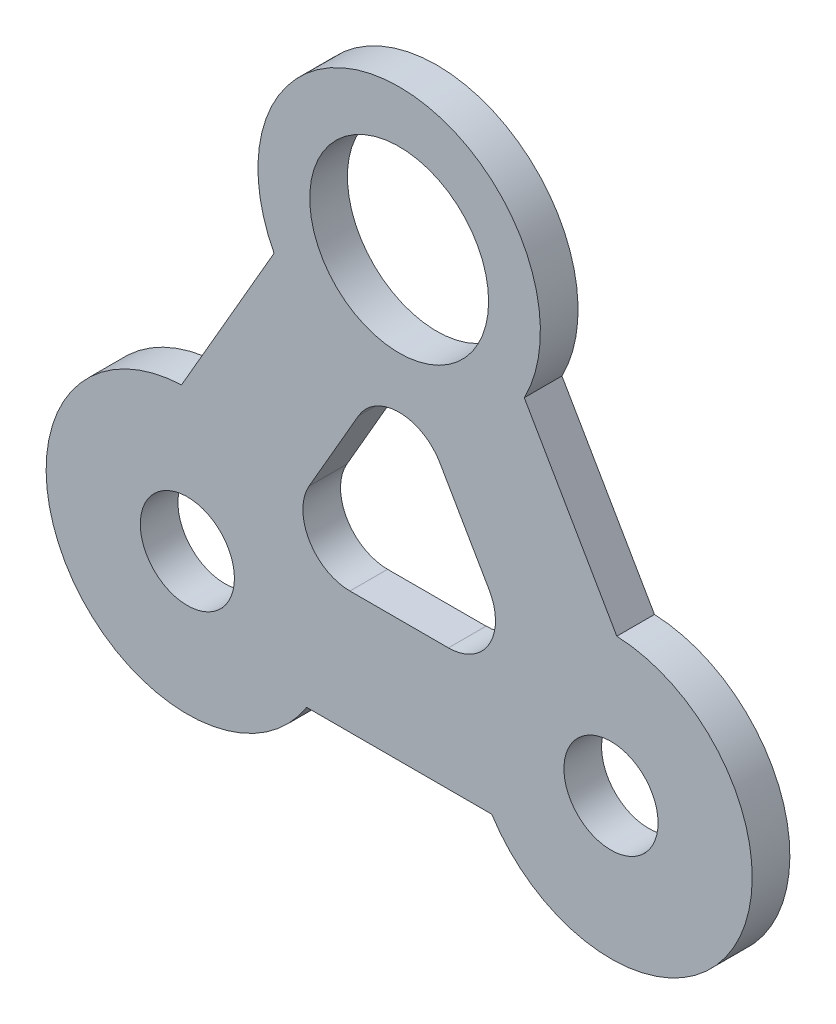
ISO-10303-21;
HEADER;
FILE_DESCRIPTION(('STEP AP214'),'2;1');
FILE_NAME('part.step','',(''),(''),'','','');
FILE_SCHEMA(('AUTOMOTIVE_DESIGN { 1 0 10303 214 1 1 1 1 }'));
ENDSEC;
DATA;
#1=APPLICATION_CONTEXT('core data for automotive mechanical design processes');
#2=APPLICATION_PROTOCOL_DEFINITION('international standard','automotive_design',2000,#1);
#3=PRODUCT_CONTEXT('',#1,'mechanical');
#4=PRODUCT('Part','Part','',(#3));
#5=PRODUCT_RELATED_PRODUCT_CATEGORY('part','',(#4));
#6=PRODUCT_DEFINITION_FORMATION('','',#4);
#7=PRODUCT_DEFINITION_CONTEXT('part definition',#1,'design');
#8=PRODUCT_DEFINITION('design','',#6,#7);
#9=PRODUCT_DEFINITION_SHAPE('','',#8);
#10=(LENGTH_UNIT() NAMED_UNIT(*) SI_UNIT(.MILLI.,.METRE.));
#11=(NAMED_UNIT(*) PLANE_ANGLE_UNIT() SI_UNIT($,.RADIAN.));
#12=(NAMED_UNIT(*) SI_UNIT($,.STERADIAN.) SOLID_ANGLE_UNIT());
#13=UNCERTAINTY_MEASURE_WITH_UNIT(LENGTH_MEASURE(1.E-05),#10,'distance_accuracy_value','');
#14=(GEOMETRIC_REPRESENTATION_CONTEXT(3) GLOBAL_UNCERTAINTY_ASSIGNED_CONTEXT((#13)) GLOBAL_UNIT_ASSIGNED_CONTEXT((#10,
#11,#12)) REPRESENTATION_CONTEXT('',''));
#15=CARTESIAN_POINT('',(0.,0.,0.));
#16=DIRECTION('',(0.,0.,1.));
#17=DIRECTION('',(1.,0.,0.));
#18=AXIS2_PLACEMENT_3D('',#15,#16,#17);
#19=CARTESIAN_POINT('',(0.,0.,4.));
#20=DIRECTION('',(0.,0.,1.));
#21=DIRECTION('',(1.,0.,0.));
#22=AXIS2_PLACEMENT_3D('',#19,#20,#21);
#23=PLANE('',#22);
#24=CARTESIAN_POINT('',(22.5,-38.9711431702997,4.));
#25=DIRECTION('',(0.,0.,1.));
#26=DIRECTION('',(1.,0.,0.));
#27=AXIS2_PLACEMENT_3D('',#24,#25,#26);
#28=CIRCLE('',#27,5.00000000000001);
#29=CARTESIAN_POINT('',(27.5,-38.9711431702997,4.));
#30=VERTEX_POINT('',#29);
#31=EDGE_CURVE('E206',#30,#30,#28,.T.);
#32=ORIENTED_EDGE('',*,*,#31,.F.);
#33=EDGE_LOOP('',(#32));
#34=FACE_BOUND('',#33,.T.);
#35=DIRECTION('',(-0.500000000000004,-0.866025403784436,0.));
#36=VECTOR('',#35,1.);
#37=CARTESIAN_POINT('',(-18.2031939778686,-15.4711431702998,4.));
#38=LINE('',#37,#36);
#39=CARTESIAN_POINT('',(-13.2883628392364,-6.95840592756717,4.));
#40=VERTEX_POINT('',#39);
#41=CARTESIAN_POINT('',(-23.1180251165009,-23.9838804130323,4.));
#42=VERTEX_POINT('',#41);
#43=EDGE_CURVE('E222',#40,#42,#38,.T.);
#44=ORIENTED_EDGE('',*,*,#43,.T.);
#45=CARTESIAN_POINT('',(-22.5,-38.9711431702997,4.));
#46=DIRECTION('',(0.,0.,1.));
#47=DIRECTION('',(-1.,0.,0.));
#48=AXIS2_PLACEMENT_3D('',#45,#46,#47);
#49=CIRCLE('',#48,15.);
#50=CARTESIAN_POINT('',(-9.82966227726444,-47.,4.));
#51=VERTEX_POINT('',#50);
#52=EDGE_CURVE('E225',#42,#51,#49,.T.);
#53=ORIENTED_EDGE('',*,*,#52,.T.);
#54=DIRECTION('',(1.,0.,0.));
#55=VECTOR('',#54,1.);
#56=CARTESIAN_POINT('',(0.,-47.,4.));
#57=LINE('',#56,#55);
#58=CARTESIAN_POINT('',(9.82966227726446,-47.,4.));
#59=VERTEX_POINT('',#58);
#60=EDGE_CURVE('E229',#51,#59,#57,.T.);
#61=ORIENTED_EDGE('',*,*,#60,.T.);
#62=CARTESIAN_POINT('',(22.5000000000001,-38.9711431702998,4.));
#63=DIRECTION('',(0.,0.,1.));
#64=DIRECTION('',(-1.,0.,0.));
#65=AXIS2_PLACEMENT_3D('',#62,#63,#64);
#66=CIRCLE('',#65,15.0000000000001);
#67=CARTESIAN_POINT('',(23.1180251165009,-23.9838804130323,4.));
#68=VERTEX_POINT('',#67);
#69=EDGE_CURVE('E232',#59,#68,#66,.T.);
#70=ORIENTED_EDGE('',*,*,#69,.T.);
#71=DIRECTION('',(-0.500000000000005,0.866025403784436,0.));
#72=VECTOR('',#71,1.);
#73=CARTESIAN_POINT('',(18.2031939778686,-15.4711431702998,4.));
#74=LINE('',#73,#72);
#75=CARTESIAN_POINT('',(13.2883628392364,-6.95840592756718,4.));
#76=VERTEX_POINT('',#75);
#77=EDGE_CURVE('E235',#68,#76,#74,.T.);
#78=ORIENTED_EDGE('',*,*,#77,.T.);
#79=CARTESIAN_POINT('',(0.,0.,4.));
#80=DIRECTION('',(0.,0.,1.));
#81=DIRECTION('',(1.,0.,0.));
#82=AXIS2_PLACEMENT_3D('',#79,#80,#81);
#83=CIRCLE('',#82,15.);
#84=EDGE_CURVE('E238',#76,#40,#83,.T.);
#85=ORIENTED_EDGE('',*,*,#84,.T.);
#86=EDGE_LOOP('',(#44,#53,#61,#70,#78,#85));
#87=FACE_BOUND('',#86,.T.);
#88=CARTESIAN_POINT('',(0.,0.,4.));
#89=DIRECTION('',(0.,0.,1.));
#90=DIRECTION('',(1.,0.,0.));
#91=AXIS2_PLACEMENT_3D('',#88,#89,#90);
#92=CIRCLE('',#91,9.5);
#93=CARTESIAN_POINT('',(9.5,0.,4.));
#94=VERTEX_POINT('',#93);
#95=EDGE_CURVE('E214',#94,#94,#92,.T.);
#96=ORIENTED_EDGE('',*,*,#95,.F.);
#97=EDGE_LOOP('',(#96));
#98=FACE_BOUND('',#97,.T.);
#99=CARTESIAN_POINT('',(-22.5,-38.9711431702997,4.));
#100=DIRECTION('',(0.,0.,1.));
#101=DIRECTION('',(1.,0.,0.));
#102=AXIS2_PLACEMENT_3D('',#99,#100,#101);
#103=CIRCLE('',#102,5.);
#104=CARTESIAN_POINT('',(-17.5,-38.9711431702997,4.));
#105=VERTEX_POINT('',#104);
#106=EDGE_CURVE('E198',#105,#105,#103,.T.);
#107=ORIENTED_EDGE('',*,*,#106,.F.);
#108=EDGE_LOOP('',(#107));
#109=FACE_BOUND('',#108,.T.);
#110=DIRECTION('',(-0.500000000000004,0.866025403784436,0.));
#111=VECTOR('',#110,1.);
#112=CARTESIAN_POINT('',(9.55960043841965,-26.5,4.));
#113=LINE('',#112,#111);
#114=CARTESIAN_POINT('',(9.55960043841965,-26.5,4.));
#115=VERTEX_POINT('',#114);
#116=CARTESIAN_POINT('',(4.33012701892218,-17.4422863405995,4.));
#117=VERTEX_POINT('',#116);
#118=EDGE_CURVE('E138',#115,#117,#113,.T.);
#119=ORIENTED_EDGE('',*,*,#118,.F.);
#120=CARTESIAN_POINT('',(5.22947341949744,-29.,4.));
#121=DIRECTION('',(0.,0.,1.));
#122=DIRECTION('',(1.,0.,0.));
#123=AXIS2_PLACEMENT_3D('',#120,#121,#122);
#124=CIRCLE('',#123,5.00000000000002);
#125=CARTESIAN_POINT('',(5.22947341949747,-34.,4.));
#126=VERTEX_POINT('',#125);
#127=EDGE_CURVE('E129',#126,#115,#124,.T.);
#128=ORIENTED_EDGE('',*,*,#127,.F.);
#129=DIRECTION('',(1.,0.,0.));
#130=VECTOR('',#129,1.);
#131=CARTESIAN_POINT('',(5.22947341949747,-34.,4.));
#132=LINE('',#131,#130);
#133=CARTESIAN_POINT('',(-5.22947341949747,-34.,4.));
#134=VERTEX_POINT('',#133);
#135=EDGE_CURVE('E164',#134,#126,#132,.T.);
#136=ORIENTED_EDGE('',*,*,#135,.F.);
#137=CARTESIAN_POINT('',(-5.22947341949746,-29.,4.));
#138=DIRECTION('',(0.,0.,1.));
#139=DIRECTION('',(-1.,0.,0.));
#140=AXIS2_PLACEMENT_3D('',#137,#138,#139);
#141=CIRCLE('',#140,5.);
#142=CARTESIAN_POINT('',(-9.55960043841965,-26.5,4.));
#143=VERTEX_POINT('',#142);
#144=EDGE_CURVE('E161',#143,#134,#141,.T.);
#145=ORIENTED_EDGE('',*,*,#144,.F.);
#146=DIRECTION('',(-0.500000000000004,-0.866025403784436,0.));
#147=VECTOR('',#146,1.);
#148=CARTESIAN_POINT('',(-4.33012701892218,-17.4422863405995,4.));
#149=LINE('',#148,#147);
#150=CARTESIAN_POINT('',(-4.33012701892219,-17.4422863405995,4.));
#151=VERTEX_POINT('',#150);
#152=EDGE_CURVE('E156',#151,#143,#149,.T.);
#153=ORIENTED_EDGE('',*,*,#152,.F.);
#154=CARTESIAN_POINT('',(0.,-19.9422863405995,4.));
#155=DIRECTION('',(0.,0.,1.));
#156=DIRECTION('',(1.,0.,0.));
#157=AXIS2_PLACEMENT_3D('',#154,#155,#156);
#158=CIRCLE('',#157,5.00000000000001);
#159=EDGE_CURVE('E152',#117,#151,#158,.T.);
#160=ORIENTED_EDGE('',*,*,#159,.F.);
#161=EDGE_LOOP('',(#119,#128,#136,#145,#153,#160));
#162=FACE_BOUND('',#161,.T.);
#163=ADVANCED_FACE('F39',(#34,#87,#98,#109,#162),#23,.T.);
#164=CARTESIAN_POINT('',(0.,0.,0.));
#165=DIRECTION('',(0.,0.,1.));
#166=DIRECTION('',(1.,0.,0.));
#167=AXIS2_PLACEMENT_3D('',#164,#165,#166);
#168=PLANE('',#167);
#169=CARTESIAN_POINT('',(-22.5,-38.9711431702997,0.));
#170=DIRECTION('',(0.,0.,1.));
#171=DIRECTION('',(1.,0.,0.));
#172=AXIS2_PLACEMENT_3D('',#169,#170,#171);
#173=CIRCLE('',#172,5.);
#174=CARTESIAN_POINT('',(-17.5,-38.9711431702997,0.));
#175=VERTEX_POINT('',#174);
#176=EDGE_CURVE('E147',#175,#175,#173,.T.);
#177=ORIENTED_EDGE('',*,*,#176,.T.);
#178=EDGE_LOOP('',(#177));
#179=FACE_BOUND('',#178,.T.);
#180=CARTESIAN_POINT('',(22.5,-38.9711431702997,0.));
#181=DIRECTION('',(0.,0.,1.));
#182=DIRECTION('',(1.,0.,0.));
#183=AXIS2_PLACEMENT_3D('',#180,#181,#182);
#184=CIRCLE('',#183,5.00000000000001);
#185=CARTESIAN_POINT('',(27.5,-38.9711431702997,0.));
#186=VERTEX_POINT('',#185);
#187=EDGE_CURVE('E202',#186,#186,#184,.T.);
#188=ORIENTED_EDGE('',*,*,#187,.T.);
#189=EDGE_LOOP('',(#188));
#190=FACE_BOUND('',#189,.T.);
#191=CARTESIAN_POINT('',(0.,0.,0.));
#192=DIRECTION('',(0.,0.,1.));
#193=DIRECTION('',(1.,0.,0.));
#194=AXIS2_PLACEMENT_3D('',#191,#192,#193);
#195=CIRCLE('',#194,9.5);
#196=CARTESIAN_POINT('',(9.5,0.,0.));
#197=VERTEX_POINT('',#196);
#198=EDGE_CURVE('E210',#197,#197,#195,.T.);
#199=ORIENTED_EDGE('',*,*,#198,.T.);
#200=EDGE_LOOP('',(#199));
#201=FACE_BOUND('',#200,.T.);
#202=DIRECTION('',(-0.500000000000004,-0.866025403784436,0.));
#203=VECTOR('',#202,1.);
#204=CARTESIAN_POINT('',(-18.2031939778686,-15.4711431702998,0.));
#205=LINE('',#204,#203);
#206=CARTESIAN_POINT('',(-13.2883628392364,-6.95840592756717,0.));
#207=VERTEX_POINT('',#206);
#208=CARTESIAN_POINT('',(-23.1180251165009,-23.9838804130323,0.));
#209=VERTEX_POINT('',#208);
#210=EDGE_CURVE('E218',#207,#209,#205,.T.);
#211=ORIENTED_EDGE('',*,*,#210,.F.);
#212=CARTESIAN_POINT('',(0.,0.,0.));
#213=DIRECTION('',(0.,0.,1.));
#214=DIRECTION('',(1.,0.,0.));
#215=AXIS2_PLACEMENT_3D('',#212,#213,#214);
#216=CIRCLE('',#215,15.);
#217=CARTESIAN_POINT('',(13.2883628392364,-6.95840592756718,0.));
#218=VERTEX_POINT('',#217);
#219=EDGE_CURVE('E226',#218,#207,#216,.T.);
#220=ORIENTED_EDGE('',*,*,#219,.F.);
#221=DIRECTION('',(-0.500000000000005,0.866025403784436,0.));
#222=VECTOR('',#221,1.);
#223=CARTESIAN_POINT('',(18.2031939778686,-15.4711431702998,0.));
#224=LINE('',#223,#222);
#225=CARTESIAN_POINT('',(23.1180251165009,-23.9838804130323,0.));
#226=VERTEX_POINT('',#225);
#227=EDGE_CURVE('E255',#226,#218,#224,.T.);
#228=ORIENTED_EDGE('',*,*,#227,.F.);
#229=CARTESIAN_POINT('',(22.5000000000001,-38.9711431702998,0.));
#230=DIRECTION('',(0.,0.,1.));
#231=DIRECTION('',(-1.,0.,0.));
#232=AXIS2_PLACEMENT_3D('',#229,#230,#231);
#233=CIRCLE('',#232,15.0000000000001);
#234=CARTESIAN_POINT('',(9.82966227726446,-47.,0.));
#235=VERTEX_POINT('',#234);
#236=EDGE_CURVE('E251',#235,#226,#233,.T.);
#237=ORIENTED_EDGE('',*,*,#236,.F.);
#238=DIRECTION('',(1.,0.,0.));
#239=VECTOR('',#238,1.);
#240=CARTESIAN_POINT('',(0.,-47.,0.));
#241=LINE('',#240,#239);
#242=CARTESIAN_POINT('',(-9.82966227726444,-47.,0.));
#243=VERTEX_POINT('',#242);
#244=EDGE_CURVE('E248',#243,#235,#241,.T.);
#245=ORIENTED_EDGE('',*,*,#244,.F.);
#246=CARTESIAN_POINT('',(-22.5,-38.9711431702997,0.));
#247=DIRECTION('',(0.,0.,1.));
#248=DIRECTION('',(-1.,0.,0.));
#249=AXIS2_PLACEMENT_3D('',#246,#247,#248);
#250=CIRCLE('',#249,15.);
#251=EDGE_CURVE('E244',#209,#243,#250,.T.);
#252=ORIENTED_EDGE('',*,*,#251,.F.);
#253=EDGE_LOOP('',(#211,#220,#228,#237,#245,#252));
#254=FACE_BOUND('',#253,.T.);
#255=CARTESIAN_POINT('',(5.22947341949744,-29.,0.));
#256=DIRECTION('',(0.,0.,1.));
#257=DIRECTION('',(1.,0.,0.));
#258=AXIS2_PLACEMENT_3D('',#255,#256,#257);
#259=CIRCLE('',#258,5.00000000000002);
#260=CARTESIAN_POINT('',(5.22947341949747,-34.,0.));
#261=VERTEX_POINT('',#260);
#262=CARTESIAN_POINT('',(9.55960043841965,-26.5,0.));
#263=VERTEX_POINT('',#262);
#264=EDGE_CURVE('E63',#261,#263,#259,.T.);
#265=ORIENTED_EDGE('',*,*,#264,.T.);
#266=DIRECTION('',(-0.500000000000004,0.866025403784436,0.));
#267=VECTOR('',#266,1.);
#268=CARTESIAN_POINT('',(9.55960043841965,-26.5,0.));
#269=LINE('',#268,#267);
#270=CARTESIAN_POINT('',(4.33012701892218,-17.4422863405995,0.));
#271=VERTEX_POINT('',#270);
#272=EDGE_CURVE('E145',#263,#271,#269,.T.);
#273=ORIENTED_EDGE('',*,*,#272,.T.);
#274=CARTESIAN_POINT('',(0.,-19.9422863405995,0.));
#275=DIRECTION('',(0.,0.,1.));
#276=DIRECTION('',(1.,0.,0.));
#277=AXIS2_PLACEMENT_3D('',#274,#275,#276);
#278=CIRCLE('',#277,5.00000000000001);
#279=CARTESIAN_POINT('',(-4.33012701892219,-17.4422863405995,0.));
#280=VERTEX_POINT('',#279);
#281=EDGE_CURVE('E171',#271,#280,#278,.T.);
#282=ORIENTED_EDGE('',*,*,#281,.T.);
#283=DIRECTION('',(-0.500000000000004,-0.866025403784436,0.));
#284=VECTOR('',#283,1.);
#285=CARTESIAN_POINT('',(-4.33012701892218,-17.4422863405995,0.));
#286=LINE('',#285,#284);
#287=CARTESIAN_POINT('',(-9.55960043841965,-26.5,0.));
#288=VERTEX_POINT('',#287);
#289=EDGE_CURVE('E175',#280,#288,#286,.T.);
#290=ORIENTED_EDGE('',*,*,#289,.T.);
#291=CARTESIAN_POINT('',(-5.22947341949746,-29.,0.));
#292=DIRECTION('',(0.,0.,1.));
#293=DIRECTION('',(-1.,0.,0.));
#294=AXIS2_PLACEMENT_3D('',#291,#292,#293);
#295=CIRCLE('',#294,5.);
#296=CARTESIAN_POINT('',(-5.22947341949747,-34.,0.));
#297=VERTEX_POINT('',#296);
#298=EDGE_CURVE('E179',#288,#297,#295,.T.);
#299=ORIENTED_EDGE('',*,*,#298,.T.);
#300=DIRECTION('',(1.,0.,0.));
#301=VECTOR('',#300,1.);
#302=CARTESIAN_POINT('',(5.22947341949747,-34.,0.));
#303=LINE('',#302,#301);
#304=EDGE_CURVE('E139',#297,#261,#303,.T.);
#305=ORIENTED_EDGE('',*,*,#304,.T.);
#306=EDGE_LOOP('',(#265,#273,#282,#290,#299,#305));
#307=FACE_BOUND('',#306,.T.);
#308=ADVANCED_FACE('F288',(#179,#190,#201,#254,#307),#168,.F.);
#309=CARTESIAN_POINT('',(-18.2031939778686,-15.4711431702998,4.));
#310=DIRECTION('',(0.866025403784436,-0.500000000000004,0.));
#311=DIRECTION('',(0.500000000000004,0.866025403784436,0.));
#312=AXIS2_PLACEMENT_3D('',#309,#310,#311);
#313=PLANE('',#312);
#314=ORIENTED_EDGE('',*,*,#210,.T.);
#315=DIRECTION('',(0.,0.,-1.));
#316=VECTOR('',#315,1.);
#317=CARTESIAN_POINT('',(-23.1180251165009,-23.9838804130323,4.));
#318=LINE('',#317,#316);
#319=EDGE_CURVE('E11',#42,#209,#318,.T.);
#320=ORIENTED_EDGE('',*,*,#319,.F.);
#321=ORIENTED_EDGE('',*,*,#43,.F.);
#322=DIRECTION('',(0.,0.,-1.));
#323=VECTOR('',#322,1.);
#324=CARTESIAN_POINT('',(-13.2883628392364,-6.95840592756717,4.));
#325=LINE('',#324,#323);
#326=EDGE_CURVE('E241',#40,#207,#325,.T.);
#327=ORIENTED_EDGE('',*,*,#326,.T.);
#328=EDGE_LOOP('',(#314,#320,#321,#327));
#329=FACE_BOUND('',#328,.T.);
#330=ADVANCED_FACE('F41',(#329),#313,.F.);
#331=CARTESIAN_POINT('',(-22.5,-38.9711431702997,4.));
#332=DIRECTION('',(0.,0.,-1.));
#333=DIRECTION('',(-1.,0.,0.));
#334=AXIS2_PLACEMENT_3D('',#331,#332,#333);
#335=CYLINDRICAL_SURFACE('',#334,15.);
#336=ORIENTED_EDGE('',*,*,#251,.T.);
#337=DIRECTION('',(0.,0.,-1.));
#338=VECTOR('',#337,1.);
#339=CARTESIAN_POINT('',(-9.82966227726444,-47.,4.));
#340=LINE('',#339,#338);
#341=EDGE_CURVE('E48',#51,#243,#340,.T.);
#342=ORIENTED_EDGE('',*,*,#341,.F.);
#343=ORIENTED_EDGE('',*,*,#52,.F.);
#344=ORIENTED_EDGE('',*,*,#319,.T.);
#345=EDGE_LOOP('',(#336,#342,#343,#344));
#346=FACE_BOUND('',#345,.T.);
#347=ADVANCED_FACE('F284',(#346),#335,.T.);
#348=CARTESIAN_POINT('',(0.,-47.,4.));
#349=DIRECTION('',(0.,1.,0.));
#350=DIRECTION('',(0.,0.,1.));
#351=AXIS2_PLACEMENT_3D('',#348,#349,#350);
#352=PLANE('',#351);
#353=ORIENTED_EDGE('',*,*,#244,.T.);
#354=DIRECTION('',(0.,0.,-1.));
#355=VECTOR('',#354,1.);
#356=CARTESIAN_POINT('',(9.82966227726446,-47.,4.));
#357=LINE('',#356,#355);
#358=EDGE_CURVE('E272',#59,#235,#357,.T.);
#359=ORIENTED_EDGE('',*,*,#358,.F.);
#360=ORIENTED_EDGE('',*,*,#60,.F.);
#361=ORIENTED_EDGE('',*,*,#341,.T.);
#362=EDGE_LOOP('',(#353,#359,#360,#361));
#363=FACE_BOUND('',#362,.T.);
#364=ADVANCED_FACE('F280',(#363),#352,.F.);
#365=CARTESIAN_POINT('',(22.5000000000001,-38.9711431702998,4.));
#366=DIRECTION('',(0.,0.,-1.));
#367=DIRECTION('',(-1.,0.,0.));
#368=AXIS2_PLACEMENT_3D('',#365,#366,#367);
#369=CYLINDRICAL_SURFACE('',#368,15.0000000000001);
#370=ORIENTED_EDGE('',*,*,#236,.T.);
#371=DIRECTION('',(0.,0.,-1.));
#372=VECTOR('',#371,1.);
#373=CARTESIAN_POINT('',(23.1180251165009,-23.9838804130323,4.));
#374=LINE('',#373,#372);
#375=EDGE_CURVE('E268',#68,#226,#374,.T.);
#376=ORIENTED_EDGE('',*,*,#375,.F.);
#377=ORIENTED_EDGE('',*,*,#69,.F.);
#378=ORIENTED_EDGE('',*,*,#358,.T.);
#379=EDGE_LOOP('',(#370,#376,#377,#378));
#380=FACE_BOUND('',#379,.T.);
#381=ADVANCED_FACE('F294',(#380),#369,.T.);
#382=CARTESIAN_POINT('',(18.2031939778686,-15.4711431702998,4.));
#383=DIRECTION('',(-0.866025403784436,-0.500000000000005,0.));
#384=DIRECTION('',(0.500000000000005,-0.866025403784436,0.));
#385=AXIS2_PLACEMENT_3D('',#382,#383,#384);
#386=PLANE('',#385);
#387=ORIENTED_EDGE('',*,*,#227,.T.);
#388=DIRECTION('',(0.,0.,-1.));
#389=VECTOR('',#388,1.);
#390=CARTESIAN_POINT('',(13.2883628392364,-6.95840592756718,4.));
#391=LINE('',#390,#389);
#392=EDGE_CURVE('E264',#76,#218,#391,.T.);
#393=ORIENTED_EDGE('',*,*,#392,.F.);
#394=ORIENTED_EDGE('',*,*,#77,.F.);
#395=ORIENTED_EDGE('',*,*,#375,.T.);
#396=EDGE_LOOP('',(#387,#393,#394,#395));
#397=FACE_BOUND('',#396,.T.);
#398=ADVANCED_FACE('F298',(#397),#386,.F.);
#399=CARTESIAN_POINT('',(0.,0.,4.));
#400=DIRECTION('',(0.,0.,-1.));
#401=DIRECTION('',(-1.,0.,0.));
#402=AXIS2_PLACEMENT_3D('',#399,#400,#401);
#403=CYLINDRICAL_SURFACE('',#402,15.);
#404=ORIENTED_EDGE('',*,*,#219,.T.);
#405=ORIENTED_EDGE('',*,*,#326,.F.);
#406=ORIENTED_EDGE('',*,*,#84,.F.);
#407=ORIENTED_EDGE('',*,*,#392,.T.);
#408=EDGE_LOOP('',(#404,#405,#406,#407));
#409=FACE_BOUND('',#408,.T.);
#410=ADVANCED_FACE('F307',(#409),#403,.T.);
#411=CARTESIAN_POINT('',(0.,0.,4.));
#412=DIRECTION('',(0.,0.,-1.));
#413=DIRECTION('',(-1.,0.,0.));
#414=AXIS2_PLACEMENT_3D('',#411,#412,#413);
#415=CYLINDRICAL_SURFACE('',#414,9.5);
#416=ORIENTED_EDGE('',*,*,#95,.T.);
#417=EDGE_LOOP('',(#416));
#418=FACE_BOUND('',#417,.T.);
#419=ORIENTED_EDGE('',*,*,#198,.F.);
#420=EDGE_LOOP('',(#419));
#421=FACE_BOUND('',#420,.T.);
#422=ADVANCED_FACE('F309',(#418,#421),#415,.F.);
#423=CARTESIAN_POINT('',(22.5,-38.9711431702997,4.));
#424=DIRECTION('',(0.,0.,-1.));
#425=DIRECTION('',(-1.,0.,0.));
#426=AXIS2_PLACEMENT_3D('',#423,#424,#425);
#427=CYLINDRICAL_SURFACE('',#426,5.00000000000001);
#428=ORIENTED_EDGE('',*,*,#31,.T.);
#429=EDGE_LOOP('',(#428));
#430=FACE_BOUND('',#429,.T.);
#431=ORIENTED_EDGE('',*,*,#187,.F.);
#432=EDGE_LOOP('',(#431));
#433=FACE_BOUND('',#432,.T.);
#434=ADVANCED_FACE('F315',(#430,#433),#427,.F.);
#435=CARTESIAN_POINT('',(-22.5,-38.9711431702997,4.));
#436=DIRECTION('',(0.,0.,-1.));
#437=DIRECTION('',(-1.,0.,0.));
#438=AXIS2_PLACEMENT_3D('',#435,#436,#437);
#439=CYLINDRICAL_SURFACE('',#438,5.);
#440=ORIENTED_EDGE('',*,*,#106,.T.);
#441=EDGE_LOOP('',(#440));
#442=FACE_BOUND('',#441,.T.);
#443=ORIENTED_EDGE('',*,*,#176,.F.);
#444=EDGE_LOOP('',(#443));
#445=FACE_BOUND('',#444,.T.);
#446=ADVANCED_FACE('F331',(#442,#445),#439,.F.);
#447=CARTESIAN_POINT('',(5.22947341949744,-29.,4.));
#448=DIRECTION('',(0.,0.,-1.));
#449=DIRECTION('',(-1.,0.,0.));
#450=AXIS2_PLACEMENT_3D('',#447,#448,#449);
#451=CYLINDRICAL_SURFACE('',#450,5.00000000000002);
#452=ORIENTED_EDGE('',*,*,#264,.F.);
#453=DIRECTION('',(0.,0.,-1.));
#454=VECTOR('',#453,1.);
#455=CARTESIAN_POINT('',(5.22947341949747,-34.,4.));
#456=LINE('',#455,#454);
#457=EDGE_CURVE('E133',#126,#261,#456,.T.);
#458=ORIENTED_EDGE('',*,*,#457,.F.);
#459=ORIENTED_EDGE('',*,*,#127,.T.);
#460=DIRECTION('',(0.,0.,-1.));
#461=VECTOR('',#460,1.);
#462=CARTESIAN_POINT('',(9.55960043841965,-26.5,4.));
#463=LINE('',#462,#461);
#464=EDGE_CURVE('E132',#115,#263,#463,.T.);
#465=ORIENTED_EDGE('',*,*,#464,.T.);
#466=EDGE_LOOP('',(#452,#458,#459,#465));
#467=FACE_BOUND('',#466,.T.);
#468=ADVANCED_FACE('F131',(#467),#451,.F.);
#469=CARTESIAN_POINT('',(9.55960043841965,-26.5,4.));
#470=DIRECTION('',(-0.866025403784436,-0.500000000000004,0.));
#471=DIRECTION('',(0.500000000000004,-0.866025403784437,0.));
#472=AXIS2_PLACEMENT_3D('',#469,#470,#471);
#473=PLANE('',#472);
#474=ORIENTED_EDGE('',*,*,#272,.F.);
#475=ORIENTED_EDGE('',*,*,#464,.F.);
#476=ORIENTED_EDGE('',*,*,#118,.T.);
#477=DIRECTION('',(0.,0.,-1.));
#478=VECTOR('',#477,1.);
#479=CARTESIAN_POINT('',(4.33012701892218,-17.4422863405995,4.));
#480=LINE('',#479,#478);
#481=EDGE_CURVE('E148',#117,#271,#480,.T.);
#482=ORIENTED_EDGE('',*,*,#481,.T.);
#483=EDGE_LOOP('',(#474,#475,#476,#482));
#484=FACE_BOUND('',#483,.T.);
#485=ADVANCED_FACE('F142',(#484),#473,.T.);
#486=CARTESIAN_POINT('',(0.,-19.9422863405995,4.));
#487=DIRECTION('',(0.,0.,-1.));
#488=DIRECTION('',(-1.,0.,0.));
#489=AXIS2_PLACEMENT_3D('',#486,#487,#488);
#490=CYLINDRICAL_SURFACE('',#489,5.00000000000001);
#491=ORIENTED_EDGE('',*,*,#281,.F.);
#492=ORIENTED_EDGE('',*,*,#481,.F.);
#493=ORIENTED_EDGE('',*,*,#159,.T.);
#494=DIRECTION('',(0.,0.,-1.));
#495=VECTOR('',#494,1.);
#496=CARTESIAN_POINT('',(-4.33012701892219,-17.4422863405995,4.));
#497=LINE('',#496,#495);
#498=EDGE_CURVE('E193',#151,#280,#497,.T.);
#499=ORIENTED_EDGE('',*,*,#498,.T.);
#500=EDGE_LOOP('',(#491,#492,#493,#499));
#501=FACE_BOUND('',#500,.T.);
#502=ADVANCED_FACE('F340',(#501),#490,.F.);
#503=CARTESIAN_POINT('',(-4.33012701892218,-17.4422863405995,4.));
#504=DIRECTION('',(0.866025403784436,-0.500000000000004,0.));
#505=DIRECTION('',(0.500000000000004,0.866025403784437,0.));
#506=AXIS2_PLACEMENT_3D('',#503,#504,#505);
#507=PLANE('',#506);
#508=ORIENTED_EDGE('',*,*,#289,.F.);
#509=ORIENTED_EDGE('',*,*,#498,.F.);
#510=ORIENTED_EDGE('',*,*,#152,.T.);
#511=DIRECTION('',(0.,0.,-1.));
#512=VECTOR('',#511,1.);
#513=CARTESIAN_POINT('',(-9.55960043841965,-26.5,4.));
#514=LINE('',#513,#512);
#515=EDGE_CURVE('E190',#143,#288,#514,.T.);
#516=ORIENTED_EDGE('',*,*,#515,.T.);
#517=EDGE_LOOP('',(#508,#509,#510,#516));
#518=FACE_BOUND('',#517,.T.);
#519=ADVANCED_FACE('F343',(#518),#507,.T.);
#520=CARTESIAN_POINT('',(-5.22947341949746,-29.,4.));
#521=DIRECTION('',(0.,0.,-1.));
#522=DIRECTION('',(-1.,0.,0.));
#523=AXIS2_PLACEMENT_3D('',#520,#521,#522);
#524=CYLINDRICAL_SURFACE('',#523,5.);
#525=ORIENTED_EDGE('',*,*,#298,.F.);
#526=ORIENTED_EDGE('',*,*,#515,.F.);
#527=ORIENTED_EDGE('',*,*,#144,.T.);
#528=DIRECTION('',(0.,0.,-1.));
#529=VECTOR('',#528,1.);
#530=CARTESIAN_POINT('',(-5.22947341949747,-34.,4.));
#531=LINE('',#530,#529);
#532=EDGE_CURVE('E55',#134,#297,#531,.T.);
#533=ORIENTED_EDGE('',*,*,#532,.T.);
#534=EDGE_LOOP('',(#525,#526,#527,#533));
#535=FACE_BOUND('',#534,.T.);
#536=ADVANCED_FACE('F347',(#535),#524,.F.);
#537=CARTESIAN_POINT('',(5.22947341949747,-34.,4.));
#538=DIRECTION('',(0.,1.,0.));
#539=DIRECTION('',(0.,0.,1.));
#540=AXIS2_PLACEMENT_3D('',#537,#538,#539);
#541=PLANE('',#540);
#542=ORIENTED_EDGE('',*,*,#304,.F.);
#543=ORIENTED_EDGE('',*,*,#532,.F.);
#544=ORIENTED_EDGE('',*,*,#135,.T.);
#545=ORIENTED_EDGE('',*,*,#457,.T.);
#546=EDGE_LOOP('',(#542,#543,#544,#545));
#547=FACE_BOUND('',#546,.T.);
#548=ADVANCED_FACE('F351',(#547),#541,.T.);
#549=CLOSED_SHELL('',(#163,#308,#330,#347,#364,#381,#398,#410,#422,#434,#446,#468,#485,#502,
#519,#536,#548));
#550=MANIFOLD_SOLID_BREP('B2',#549);
#551=ADVANCED_BREP_SHAPE_REPRESENTATION('',(#18,#550),#14);
#552=SHAPE_DEFINITION_REPRESENTATION(#9,#551);
ENDSEC;
END-ISO-10303-21;
